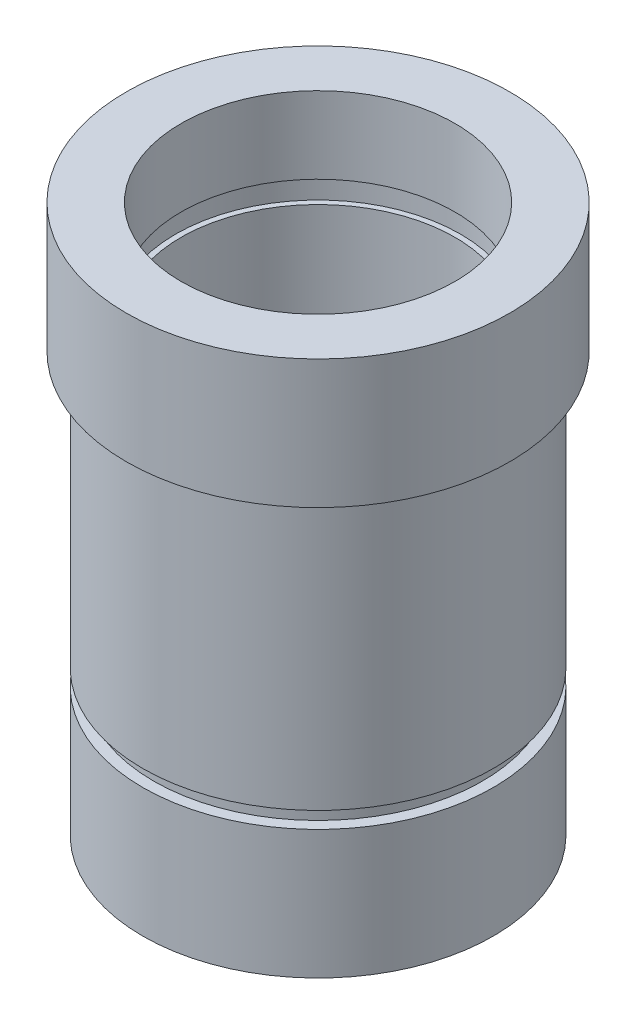
ISO-10303-21;
HEADER;
FILE_DESCRIPTION(('STEP AP214'),'2;1');
FILE_NAME('part.step','',(''),(''),'','','');
FILE_SCHEMA(('AUTOMOTIVE_DESIGN { 1 0 10303 214 1 1 1 1 }'));
ENDSEC;
DATA;
#1=APPLICATION_CONTEXT('core data for automotive mechanical design processes');
#2=APPLICATION_PROTOCOL_DEFINITION('international standard','automotive_design',2000,#1);
#3=PRODUCT_CONTEXT('',#1,'mechanical');
#4=PRODUCT('Part','Part','',(#3));
#5=PRODUCT_RELATED_PRODUCT_CATEGORY('part','',(#4));
#6=PRODUCT_DEFINITION_FORMATION('','',#4);
#7=PRODUCT_DEFINITION_CONTEXT('part definition',#1,'design');
#8=PRODUCT_DEFINITION('design','',#6,#7);
#9=PRODUCT_DEFINITION_SHAPE('','',#8);
#10=(LENGTH_UNIT() NAMED_UNIT(*) SI_UNIT(.MILLI.,.METRE.));
#11=(NAMED_UNIT(*) PLANE_ANGLE_UNIT() SI_UNIT($,.RADIAN.));
#12=(NAMED_UNIT(*) SI_UNIT($,.STERADIAN.) SOLID_ANGLE_UNIT());
#13=UNCERTAINTY_MEASURE_WITH_UNIT(LENGTH_MEASURE(1.E-05),#10,'distance_accuracy_value','');
#14=(GEOMETRIC_REPRESENTATION_CONTEXT(3) GLOBAL_UNCERTAINTY_ASSIGNED_CONTEXT((#13)) GLOBAL_UNIT_ASSIGNED_CONTEXT((#10,
#11,#12)) REPRESENTATION_CONTEXT('',''));
#15=CARTESIAN_POINT('',(0.,0.,0.));
#16=DIRECTION('',(0.,0.,1.));
#17=DIRECTION('',(1.,0.,0.));
#18=AXIS2_PLACEMENT_3D('',#15,#16,#17);
#19=CARTESIAN_POINT('',(0.,-26.8678822354766,0.));
#20=DIRECTION('',(0.,1.,0.));
#21=DIRECTION('',(0.,0.,1.));
#22=AXIS2_PLACEMENT_3D('',#19,#20,#21);
#23=CYLINDRICAL_SURFACE('',#22,12.5);
#24=CARTESIAN_POINT('',(0.,14.1321177645234,0.));
#25=DIRECTION('',(0.,1.,0.));
#26=DIRECTION('',(0.,0.,1.));
#27=AXIS2_PLACEMENT_3D('',#24,#25,#26);
#28=CIRCLE('',#27,12.5);
#29=CARTESIAN_POINT('',(0.,14.1321177645234,12.5));
#30=VERTEX_POINT('',#29);
#31=EDGE_CURVE('E55',#30,#30,#28,.F.);
#32=CARTESIAN_POINT('',(0.,-17.8678822354766,0.));
#33=DIRECTION('',(0.,-1.,0.));
#34=DIRECTION('',(0.,0.,-1.));
#35=AXIS2_PLACEMENT_3D('',#32,#33,#34);
#36=CIRCLE('',#35,12.5);
#37=CARTESIAN_POINT('',(0.,-17.8678822354766,12.5));
#38=VERTEX_POINT('',#37);
#39=EDGE_CURVE('E39',#38,#38,#36,.F.);
#40=CARTESIAN_POINT('',(0.,14.1321177645234,12.5));
#41=CARTESIAN_POINT('',(0.,13.7987844311901,12.5));
#42=CARTESIAN_POINT('',(0.,13.4654510978568,12.5));
#43=CARTESIAN_POINT('',(0.,12.7987844311901,12.5));
#44=CARTESIAN_POINT('',(0.,12.4654510978568,12.5));
#45=CARTESIAN_POINT('',(0.,11.7987844311901,12.5));
#46=CARTESIAN_POINT('',(0.,11.4654510978568,12.5));
#47=CARTESIAN_POINT('',(0.,10.7987844311901,12.5));
#48=CARTESIAN_POINT('',(0.,10.4654510978568,12.5));
#49=CARTESIAN_POINT('',(0.,9.7987844311901,12.5));
#50=CARTESIAN_POINT('',(0.,9.46545109785677,12.5));
#51=CARTESIAN_POINT('',(0.,8.7987844311901,12.5));
#52=CARTESIAN_POINT('',(0.,8.46545109785676,12.5));
#53=CARTESIAN_POINT('',(0.,7.7987844311901,12.5));
#54=CARTESIAN_POINT('',(0.,7.46545109785677,12.5));
#55=CARTESIAN_POINT('',(0.,6.7987844311901,12.5));
#56=CARTESIAN_POINT('',(0.,6.46545109785677,12.5));
#57=CARTESIAN_POINT('',(0.,5.7987844311901,12.5));
#58=CARTESIAN_POINT('',(0.,5.46545109785677,12.5));
#59=CARTESIAN_POINT('',(0.,4.7987844311901,12.5));
#60=CARTESIAN_POINT('',(0.,4.46545109785677,12.5));
#61=CARTESIAN_POINT('',(0.,3.79878443119011,12.5));
#62=CARTESIAN_POINT('',(0.,3.46545109785677,12.5));
#63=CARTESIAN_POINT('',(0.,2.7987844311901,12.5));
#64=CARTESIAN_POINT('',(0.,2.46545109785677,12.5));
#65=CARTESIAN_POINT('',(0.,1.7987844311901,12.5));
#66=CARTESIAN_POINT('',(0.,1.46545109785677,12.5));
#67=CARTESIAN_POINT('',(0.,0.798784431190106,12.5));
#68=CARTESIAN_POINT('',(0.,0.465451097856772,12.5));
#69=CARTESIAN_POINT('',(0.,-0.201215568809894,12.5));
#70=CARTESIAN_POINT('',(0.,-0.534548902143226,12.5));
#71=CARTESIAN_POINT('',(0.,-1.20121556880989,12.5));
#72=CARTESIAN_POINT('',(0.,-1.53454890214323,12.5));
#73=CARTESIAN_POINT('',(0.,-2.20121556880989,12.5));
#74=CARTESIAN_POINT('',(0.,-2.53454890214323,12.5));
#75=CARTESIAN_POINT('',(0.,-3.20121556880989,12.5));
#76=CARTESIAN_POINT('',(0.,-3.53454890214323,12.5));
#77=CARTESIAN_POINT('',(0.,-4.20121556880989,12.5));
#78=CARTESIAN_POINT('',(0.,-4.53454890214323,12.5));
#79=CARTESIAN_POINT('',(0.,-5.20121556880989,12.5));
#80=CARTESIAN_POINT('',(0.,-5.53454890214322,12.5));
#81=CARTESIAN_POINT('',(0.,-6.20121556880989,12.5));
#82=CARTESIAN_POINT('',(0.,-6.53454890214322,12.5));
#83=CARTESIAN_POINT('',(0.,-7.20121556880989,12.5));
#84=CARTESIAN_POINT('',(0.,-7.53454890214322,12.5));
#85=CARTESIAN_POINT('',(0.,-8.20121556880989,12.5));
#86=CARTESIAN_POINT('',(0.,-8.53454890214322,12.5));
#87=CARTESIAN_POINT('',(0.,-9.20121556880989,12.5));
#88=CARTESIAN_POINT('',(0.,-9.53454890214322,12.5));
#89=CARTESIAN_POINT('',(0.,-10.2012155688099,12.5));
#90=CARTESIAN_POINT('',(0.,-10.5345489021432,12.5));
#91=CARTESIAN_POINT('',(0.,-11.2012155688099,12.5));
#92=CARTESIAN_POINT('',(0.,-11.5345489021432,12.5));
#93=CARTESIAN_POINT('',(0.,-12.2012155688099,12.5));
#94=CARTESIAN_POINT('',(0.,-12.5345489021432,12.5));
#95=CARTESIAN_POINT('',(0.,-13.2012155688099,12.5));
#96=CARTESIAN_POINT('',(0.,-13.5345489021432,12.5));
#97=CARTESIAN_POINT('',(0.,-14.2012155688099,12.5));
#98=CARTESIAN_POINT('',(0.,-14.5345489021432,12.5));
#99=CARTESIAN_POINT('',(0.,-15.2012155688099,12.5));
#100=CARTESIAN_POINT('',(0.,-15.5345489021432,12.5));
#101=CARTESIAN_POINT('',(0.,-16.2012155688099,12.5));
#102=CARTESIAN_POINT('',(0.,-16.5345489021432,12.5));
#103=CARTESIAN_POINT('',(0.,-17.2012155688099,12.5));
#104=CARTESIAN_POINT('',(0.,-17.5345489021432,12.5));
#105=CARTESIAN_POINT('',(0.,-17.8678822354766,12.5));
#106=B_SPLINE_CURVE_WITH_KNOTS('',3,(#40,#41,#42,#43,#44,#45,#46,#47,#48,#49,#50,#51,#52,#53,
#54,#55,#56,#57,#58,#59,#60,#61,#62,#63,#64,#65,#66,#67,#68,#69,#70,#71,#72,#73,#74,#75,#76,#77,
#78,#79,#80,#81,#82,#83,#84,#85,#86,#87,#88,#89,#90,#91,#92,#93,#94,#95,#96,#97,#98,#99,#100,
#101,#102,#103,#104,#105),.UNSPECIFIED.,.F.,.F.,(4,2,2,2,2,2,2,2,2,2,2,2,2,2,2,2,2,2,2,2,2,2,2,
2,2,2,2,2,2,2,2,2,4),(0.,1.,2.,3.,4.,5.,6.,7.,7.99999999999999,8.99999999999999,
9.99999999999999,11.,12.,13.,14.,15.,16.,17.,18.,19.,20.,21.,22.,23.,24.,25.,26.,27.,28.,29.,
30.,31.,32.),.UNSPECIFIED.);
#107=EDGE_CURVE('BSEAM35',#30,#38,#106,.T.);
#108=ORIENTED_EDGE('',*,*,#31,.F.);
#109=ORIENTED_EDGE('',*,*,#39,.F.);
#110=ORIENTED_EDGE('',*,*,#107,.T.);
#111=ORIENTED_EDGE('',*,*,#107,.F.);
#112=EDGE_LOOP('',(#108,#110,#109,#111));
#113=FACE_BOUND('',#112,.T.);
#114=ADVANCED_FACE('F35',(#113),#23,.F.);
#115=CARTESIAN_POINT('',(0.,-19.8678822354766,0.));
#116=DIRECTION('',(0.,-1.,0.));
#117=DIRECTION('',(0.,0.,-1.));
#118=AXIS2_PLACEMENT_3D('',#115,#116,#117);
#119=CIRCLE('',#118,12.5);
#120=CARTESIAN_POINT('',(0.,-19.8678822354766,12.5));
#121=VERTEX_POINT('',#120);
#122=EDGE_CURVE('E59',#121,#121,#119,.F.);
#123=CARTESIAN_POINT('',(0.,-26.8678822354766,0.));
#124=DIRECTION('',(0.,1.,0.));
#125=DIRECTION('',(0.,0.,1.));
#126=AXIS2_PLACEMENT_3D('',#123,#124,#125);
#127=CIRCLE('',#126,12.5);
#128=CARTESIAN_POINT('',(0.,-26.8678822354766,12.5));
#129=VERTEX_POINT('',#128);
#130=EDGE_CURVE('E78',#129,#129,#127,.T.);
#131=CARTESIAN_POINT('',(0.,-19.8678822354766,12.5));
#132=CARTESIAN_POINT('',(0.,-19.9407989021432,12.5));
#133=CARTESIAN_POINT('',(0.,-20.0137155688099,12.5));
#134=CARTESIAN_POINT('',(0.,-20.1595489021432,12.5));
#135=CARTESIAN_POINT('',(0.,-20.2324655688099,12.5));
#136=CARTESIAN_POINT('',(0.,-20.3782989021432,12.5));
#137=CARTESIAN_POINT('',(0.,-20.4512155688099,12.5));
#138=CARTESIAN_POINT('',(0.,-20.5970489021432,12.5));
#139=CARTESIAN_POINT('',(0.,-20.6699655688099,12.5));
#140=CARTESIAN_POINT('',(0.,-20.8157989021432,12.5));
#141=CARTESIAN_POINT('',(0.,-20.8887155688099,12.5));
#142=CARTESIAN_POINT('',(0.,-21.0345489021432,12.5));
#143=CARTESIAN_POINT('',(0.,-21.1074655688099,12.5));
#144=CARTESIAN_POINT('',(0.,-21.2532989021432,12.5));
#145=CARTESIAN_POINT('',(0.,-21.3262155688099,12.5));
#146=CARTESIAN_POINT('',(0.,-21.4720489021432,12.5));
#147=CARTESIAN_POINT('',(0.,-21.5449655688099,12.5));
#148=CARTESIAN_POINT('',(0.,-21.6907989021432,12.5));
#149=CARTESIAN_POINT('',(0.,-21.7637155688099,12.5));
#150=CARTESIAN_POINT('',(0.,-21.9095489021432,12.5));
#151=CARTESIAN_POINT('',(0.,-21.9824655688099,12.5));
#152=CARTESIAN_POINT('',(0.,-22.1282989021432,12.5));
#153=CARTESIAN_POINT('',(0.,-22.2012155688099,12.5));
#154=CARTESIAN_POINT('',(0.,-22.3470489021432,12.5));
#155=CARTESIAN_POINT('',(0.,-22.4199655688099,12.5));
#156=CARTESIAN_POINT('',(0.,-22.5657989021432,12.5));
#157=CARTESIAN_POINT('',(0.,-22.6387155688099,12.5));
#158=CARTESIAN_POINT('',(0.,-22.7845489021432,12.5));
#159=CARTESIAN_POINT('',(0.,-22.8574655688099,12.5));
#160=CARTESIAN_POINT('',(0.,-23.0032989021432,12.5));
#161=CARTESIAN_POINT('',(0.,-23.0762155688099,12.5));
#162=CARTESIAN_POINT('',(0.,-23.2220489021432,12.5));
#163=CARTESIAN_POINT('',(0.,-23.2949655688099,12.5));
#164=CARTESIAN_POINT('',(0.,-23.4407989021432,12.5));
#165=CARTESIAN_POINT('',(0.,-23.5137155688099,12.5));
#166=CARTESIAN_POINT('',(0.,-23.6595489021432,12.5));
#167=CARTESIAN_POINT('',(0.,-23.7324655688099,12.5));
#168=CARTESIAN_POINT('',(0.,-23.8782989021432,12.5));
#169=CARTESIAN_POINT('',(0.,-23.9512155688099,12.5));
#170=CARTESIAN_POINT('',(0.,-24.0970489021432,12.5));
#171=CARTESIAN_POINT('',(0.,-24.1699655688099,12.5));
#172=CARTESIAN_POINT('',(0.,-24.3157989021432,12.5));
#173=CARTESIAN_POINT('',(0.,-24.3887155688099,12.5));
#174=CARTESIAN_POINT('',(0.,-24.5345489021432,12.5));
#175=CARTESIAN_POINT('',(0.,-24.6074655688099,12.5));
#176=CARTESIAN_POINT('',(0.,-24.7532989021432,12.5));
#177=CARTESIAN_POINT('',(0.,-24.8262155688099,12.5));
#178=CARTESIAN_POINT('',(0.,-24.9720489021432,12.5));
#179=CARTESIAN_POINT('',(0.,-25.0449655688099,12.5));
#180=CARTESIAN_POINT('',(0.,-25.1907989021432,12.5));
#181=CARTESIAN_POINT('',(0.,-25.2637155688099,12.5));
#182=CARTESIAN_POINT('',(0.,-25.4095489021432,12.5));
#183=CARTESIAN_POINT('',(0.,-25.4824655688099,12.5));
#184=CARTESIAN_POINT('',(0.,-25.6282989021432,12.5));
#185=CARTESIAN_POINT('',(0.,-25.7012155688099,12.5));
#186=CARTESIAN_POINT('',(0.,-25.8470489021432,12.5));
#187=CARTESIAN_POINT('',(0.,-25.9199655688099,12.5));
#188=CARTESIAN_POINT('',(0.,-26.0657989021432,12.5));
#189=CARTESIAN_POINT('',(0.,-26.1387155688099,12.5));
#190=CARTESIAN_POINT('',(0.,-26.2845489021432,12.5));
#191=CARTESIAN_POINT('',(0.,-26.3574655688099,12.5));
#192=CARTESIAN_POINT('',(0.,-26.5032989021432,12.5));
#193=CARTESIAN_POINT('',(0.,-26.5762155688099,12.5));
#194=CARTESIAN_POINT('',(0.,-26.7220489021432,12.5));
#195=CARTESIAN_POINT('',(0.,-26.7949655688099,12.5));
#196=CARTESIAN_POINT('',(0.,-26.8678822354766,12.5));
#197=B_SPLINE_CURVE_WITH_KNOTS('',3,(#131,#132,#133,#134,#135,#136,#137,#138,#139,#140,#141,
#142,#143,#144,#145,#146,#147,#148,#149,#150,#151,#152,#153,#154,#155,#156,#157,#158,#159,#160,
#161,#162,#163,#164,#165,#166,#167,#168,#169,#170,#171,#172,#173,#174,#175,#176,#177,#178,#179,
#180,#181,#182,#183,#184,#185,#186,#187,#188,#189,#190,#191,#192,#193,#194,#195,#196),
.UNSPECIFIED.,.F.,.F.,(4,2,2,2,2,2,2,2,2,2,2,2,2,2,2,2,2,2,2,2,2,2,2,2,2,2,2,2,2,2,2,2,4),(0.,
0.21875,0.4375,0.656250000000001,0.875000000000001,1.09375,1.3125,1.53125,1.75,1.96875,2.1875,
2.40625,2.625,2.84375,3.0625,3.28125,3.5,3.71875,3.9375,4.15625,4.375,4.59375,4.8125,5.03125,
5.25,5.46875,5.68750000000001,5.90625000000001,6.12500000000001,6.34375000000001,
6.56250000000001,6.78125000000001,7.),.UNSPECIFIED.);
#198=EDGE_CURVE('BSEAM143',#121,#129,#197,.T.);
#199=ORIENTED_EDGE('',*,*,#122,.T.);
#200=ORIENTED_EDGE('',*,*,#130,.F.);
#201=ORIENTED_EDGE('',*,*,#198,.T.);
#202=ORIENTED_EDGE('',*,*,#198,.F.);
#203=EDGE_LOOP('',(#199,#201,#200,#202));
#204=FACE_BOUND('',#203,.T.);
#205=ADVANCED_FACE('F143',(#204),#23,.F.);
#206=CARTESIAN_POINT('',(0.,23.1321177645234,0.));
#207=DIRECTION('',(0.,-1.,0.));
#208=DIRECTION('',(0.,0.,-1.));
#209=AXIS2_PLACEMENT_3D('',#206,#207,#208);
#210=PLANE('',#209);
#211=CARTESIAN_POINT('',(0.,23.1321177645234,0.));
#212=DIRECTION('',(0.,1.,0.));
#213=DIRECTION('',(0.,0.,1.));
#214=AXIS2_PLACEMENT_3D('',#211,#212,#213);
#215=CIRCLE('',#214,12.5);
#216=CARTESIAN_POINT('',(0.,23.1321177645234,12.5));
#217=VERTEX_POINT('',#216);
#218=EDGE_CURVE('E58',#217,#217,#215,.T.);
#219=ORIENTED_EDGE('',*,*,#218,.F.);
#220=EDGE_LOOP('',(#219));
#221=FACE_BOUND('',#220,.T.);
#222=CARTESIAN_POINT('',(0.,23.1321177645234,0.));
#223=DIRECTION('',(0.,1.,0.));
#224=DIRECTION('',(0.,0.,1.));
#225=AXIS2_PLACEMENT_3D('',#222,#223,#224);
#226=CIRCLE('',#225,17.5);
#227=CARTESIAN_POINT('',(0.,23.1321177645234,17.5));
#228=VERTEX_POINT('',#227);
#229=EDGE_CURVE('E10',#228,#228,#226,.T.);
#230=ORIENTED_EDGE('',*,*,#229,.T.);
#231=EDGE_LOOP('',(#230));
#232=FACE_BOUND('',#231,.T.);
#233=ADVANCED_FACE('F37',(#221,#232),#210,.F.);
#234=CARTESIAN_POINT('',(0.,23.3627204030227,0.));
#235=DIRECTION('',(0.,1.,0.));
#236=DIRECTION('',(0.,0.,1.));
#237=AXIS2_PLACEMENT_3D('',#234,#235,#236);
#238=CYLINDRICAL_SURFACE('',#237,17.5);
#239=ORIENTED_EDGE('',*,*,#229,.F.);
#240=EDGE_LOOP('',(#239));
#241=FACE_BOUND('',#240,.T.);
#242=CARTESIAN_POINT('',(0.,11.3821177645234,0.));
#243=DIRECTION('',(0.,1.,0.));
#244=DIRECTION('',(0.,0.,1.));
#245=AXIS2_PLACEMENT_3D('',#242,#243,#244);
#246=CIRCLE('',#245,17.5);
#247=CARTESIAN_POINT('',(0.,11.3821177645234,17.5));
#248=VERTEX_POINT('',#247);
#249=EDGE_CURVE('E43',#248,#248,#246,.T.);
#250=ORIENTED_EDGE('',*,*,#249,.T.);
#251=EDGE_LOOP('',(#250));
#252=FACE_BOUND('',#251,.T.);
#253=ADVANCED_FACE('F259',(#241,#252),#238,.T.);
#254=CARTESIAN_POINT('',(17.5,11.3821177645234,0.));
#255=DIRECTION('',(0.,1.,0.));
#256=DIRECTION('',(0.,0.,1.));
#257=AXIS2_PLACEMENT_3D('',#254,#255,#256);
#258=PLANE('',#257);
#259=ORIENTED_EDGE('',*,*,#249,.F.);
#260=EDGE_LOOP('',(#259));
#261=FACE_BOUND('',#260,.T.);
#262=CARTESIAN_POINT('',(0.,11.3821177645234,0.));
#263=DIRECTION('',(0.,1.,0.));
#264=DIRECTION('',(0.,0.,1.));
#265=AXIS2_PLACEMENT_3D('',#262,#263,#264);
#266=CIRCLE('',#265,16.);
#267=CARTESIAN_POINT('',(0.,11.3821177645234,16.));
#268=VERTEX_POINT('',#267);
#269=EDGE_CURVE('E48',#268,#268,#266,.T.);
#270=ORIENTED_EDGE('',*,*,#269,.T.);
#271=EDGE_LOOP('',(#270));
#272=FACE_BOUND('',#271,.T.);
#273=ADVANCED_FACE('F100',(#261,#272),#258,.F.);
#274=CARTESIAN_POINT('',(0.,23.3627204030227,0.));
#275=DIRECTION('',(0.,1.,0.));
#276=DIRECTION('',(0.,0.,1.));
#277=AXIS2_PLACEMENT_3D('',#274,#275,#276);
#278=CYLINDRICAL_SURFACE('',#277,16.);
#279=ORIENTED_EDGE('',*,*,#269,.F.);
#280=EDGE_LOOP('',(#279));
#281=FACE_BOUND('',#280,.T.);
#282=CARTESIAN_POINT('',(0.,-13.6178822354766,0.));
#283=DIRECTION('',(0.,1.,0.));
#284=DIRECTION('',(0.,0.,1.));
#285=AXIS2_PLACEMENT_3D('',#282,#283,#284);
#286=CIRCLE('',#285,16.);
#287=CARTESIAN_POINT('',(0.,-13.6178822354766,16.));
#288=VERTEX_POINT('',#287);
#289=EDGE_CURVE('E95',#288,#288,#286,.T.);
#290=ORIENTED_EDGE('',*,*,#289,.T.);
#291=EDGE_LOOP('',(#290));
#292=FACE_BOUND('',#291,.T.);
#293=ADVANCED_FACE('F102',(#281,#292),#278,.T.);
#294=CARTESIAN_POINT('',(16.,-13.6178822354766,0.));
#295=DIRECTION('',(0.,1.,0.));
#296=DIRECTION('',(0.,0.,1.));
#297=AXIS2_PLACEMENT_3D('',#294,#295,#296);
#298=PLANE('',#297);
#299=ORIENTED_EDGE('',*,*,#289,.F.);
#300=EDGE_LOOP('',(#299));
#301=FACE_BOUND('',#300,.T.);
#302=CARTESIAN_POINT('',(0.,-13.6178822354766,0.));
#303=DIRECTION('',(0.,1.,0.));
#304=DIRECTION('',(0.,0.,1.));
#305=AXIS2_PLACEMENT_3D('',#302,#303,#304);
#306=CIRCLE('',#305,15.);
#307=CARTESIAN_POINT('',(0.,-13.6178822354766,15.));
#308=VERTEX_POINT('',#307);
#309=EDGE_CURVE('E92',#308,#308,#306,.T.);
#310=ORIENTED_EDGE('',*,*,#309,.T.);
#311=EDGE_LOOP('',(#310));
#312=FACE_BOUND('',#311,.T.);
#313=ADVANCED_FACE('F105',(#301,#312),#298,.F.);
#314=CARTESIAN_POINT('',(0.,23.3627204030227,0.));
#315=DIRECTION('',(0.,1.,0.));
#316=DIRECTION('',(0.,0.,1.));
#317=AXIS2_PLACEMENT_3D('',#314,#315,#316);
#318=CYLINDRICAL_SURFACE('',#317,15.);
#319=ORIENTED_EDGE('',*,*,#309,.F.);
#320=EDGE_LOOP('',(#319));
#321=FACE_BOUND('',#320,.T.);
#322=CARTESIAN_POINT('',(0.,-15.1178822354766,0.));
#323=DIRECTION('',(0.,1.,0.));
#324=DIRECTION('',(0.,0.,1.));
#325=AXIS2_PLACEMENT_3D('',#322,#323,#324);
#326=CIRCLE('',#325,15.);
#327=CARTESIAN_POINT('',(0.,-15.1178822354766,15.));
#328=VERTEX_POINT('',#327);
#329=EDGE_CURVE('E89',#328,#328,#326,.T.);
#330=ORIENTED_EDGE('',*,*,#329,.T.);
#331=EDGE_LOOP('',(#330));
#332=FACE_BOUND('',#331,.T.);
#333=ADVANCED_FACE('F111',(#321,#332),#318,.T.);
#334=CARTESIAN_POINT('',(15.,-15.1178822354766,0.));
#335=DIRECTION('',(0.,-1.,0.));
#336=DIRECTION('',(0.,0.,-1.));
#337=AXIS2_PLACEMENT_3D('',#334,#335,#336);
#338=PLANE('',#337);
#339=ORIENTED_EDGE('',*,*,#329,.F.);
#340=EDGE_LOOP('',(#339));
#341=FACE_BOUND('',#340,.T.);
#342=CARTESIAN_POINT('',(0.,-15.1178822354766,0.));
#343=DIRECTION('',(0.,1.,0.));
#344=DIRECTION('',(0.,0.,1.));
#345=AXIS2_PLACEMENT_3D('',#342,#343,#344);
#346=CIRCLE('',#345,16.);
#347=CARTESIAN_POINT('',(0.,-15.1178822354766,16.));
#348=VERTEX_POINT('',#347);
#349=EDGE_CURVE('E86',#348,#348,#346,.T.);
#350=ORIENTED_EDGE('',*,*,#349,.T.);
#351=EDGE_LOOP('',(#350));
#352=FACE_BOUND('',#351,.T.);
#353=ADVANCED_FACE('F117',(#341,#352),#338,.F.);
#354=CARTESIAN_POINT('',(0.,23.3627204030227,0.));
#355=DIRECTION('',(0.,1.,0.));
#356=DIRECTION('',(0.,0.,1.));
#357=AXIS2_PLACEMENT_3D('',#354,#355,#356);
#358=CYLINDRICAL_SURFACE('',#357,16.);
#359=ORIENTED_EDGE('',*,*,#349,.F.);
#360=EDGE_LOOP('',(#359));
#361=FACE_BOUND('',#360,.T.);
#362=CARTESIAN_POINT('',(0.,-26.8678822354766,0.));
#363=DIRECTION('',(0.,1.,0.));
#364=DIRECTION('',(0.,0.,1.));
#365=AXIS2_PLACEMENT_3D('',#362,#363,#364);
#366=CIRCLE('',#365,16.);
#367=CARTESIAN_POINT('',(0.,-26.8678822354766,16.));
#368=VERTEX_POINT('',#367);
#369=EDGE_CURVE('E81',#368,#368,#366,.T.);
#370=ORIENTED_EDGE('',*,*,#369,.T.);
#371=EDGE_LOOP('',(#370));
#372=FACE_BOUND('',#371,.T.);
#373=ADVANCED_FACE('F123',(#361,#372),#358,.T.);
#374=CARTESIAN_POINT('',(16.,-26.8678822354766,0.));
#375=DIRECTION('',(0.,1.,0.));
#376=DIRECTION('',(0.,0.,1.));
#377=AXIS2_PLACEMENT_3D('',#374,#375,#376);
#378=PLANE('',#377);
#379=ORIENTED_EDGE('',*,*,#130,.T.);
#380=EDGE_LOOP('',(#379));
#381=FACE_BOUND('',#380,.T.);
#382=ORIENTED_EDGE('',*,*,#369,.F.);
#383=EDGE_LOOP('',(#382));
#384=FACE_BOUND('',#383,.T.);
#385=ADVANCED_FACE('F129',(#381,#384),#378,.F.);
#386=CARTESIAN_POINT('',(0.,16.1321177645234,0.));
#387=DIRECTION('',(0.,1.,0.));
#388=DIRECTION('',(0.,0.,1.));
#389=AXIS2_PLACEMENT_3D('',#386,#387,#388);
#390=CIRCLE('',#389,12.5);
#391=CARTESIAN_POINT('',(0.,16.1321177645234,12.5));
#392=VERTEX_POINT('',#391);
#393=EDGE_CURVE('E52',#392,#392,#390,.F.);
#394=CARTESIAN_POINT('',(0.,16.1321177645234,12.5));
#395=CARTESIAN_POINT('',(0.,16.2050344311901,12.5));
#396=CARTESIAN_POINT('',(0.,16.2779510978568,12.5));
#397=CARTESIAN_POINT('',(0.,16.4237844311901,12.5));
#398=CARTESIAN_POINT('',(0.,16.4967010978568,12.5));
#399=CARTESIAN_POINT('',(0.,16.6425344311901,12.5));
#400=CARTESIAN_POINT('',(0.,16.7154510978568,12.5));
#401=CARTESIAN_POINT('',(0.,16.8612844311901,12.5));
#402=CARTESIAN_POINT('',(0.,16.9342010978568,12.5));
#403=CARTESIAN_POINT('',(0.,17.0800344311901,12.5));
#404=CARTESIAN_POINT('',(0.,17.1529510978568,12.5));
#405=CARTESIAN_POINT('',(0.,17.2987844311901,12.5));
#406=CARTESIAN_POINT('',(0.,17.3717010978568,12.5));
#407=CARTESIAN_POINT('',(0.,17.5175344311901,12.5));
#408=CARTESIAN_POINT('',(0.,17.5904510978568,12.5));
#409=CARTESIAN_POINT('',(0.,17.7362844311901,12.5));
#410=CARTESIAN_POINT('',(0.,17.8092010978568,12.5));
#411=CARTESIAN_POINT('',(0.,17.9550344311901,12.5));
#412=CARTESIAN_POINT('',(0.,18.0279510978568,12.5));
#413=CARTESIAN_POINT('',(0.,18.1737844311901,12.5));
#414=CARTESIAN_POINT('',(0.,18.2467010978568,12.5));
#415=CARTESIAN_POINT('',(0.,18.3925344311901,12.5));
#416=CARTESIAN_POINT('',(0.,18.4654510978568,12.5));
#417=CARTESIAN_POINT('',(0.,18.6112844311901,12.5));
#418=CARTESIAN_POINT('',(0.,18.6842010978568,12.5));
#419=CARTESIAN_POINT('',(0.,18.8300344311901,12.5));
#420=CARTESIAN_POINT('',(0.,18.9029510978568,12.5));
#421=CARTESIAN_POINT('',(0.,19.0487844311901,12.5));
#422=CARTESIAN_POINT('',(0.,19.1217010978568,12.5));
#423=CARTESIAN_POINT('',(0.,19.2675344311901,12.5));
#424=CARTESIAN_POINT('',(0.,19.3404510978568,12.5));
#425=CARTESIAN_POINT('',(0.,19.4862844311901,12.5));
#426=CARTESIAN_POINT('',(0.,19.5592010978568,12.5));
#427=CARTESIAN_POINT('',(0.,19.7050344311901,12.5));
#428=CARTESIAN_POINT('',(0.,19.7779510978568,12.5));
#429=CARTESIAN_POINT('',(0.,19.9237844311901,12.5));
#430=CARTESIAN_POINT('',(0.,19.9967010978568,12.5));
#431=CARTESIAN_POINT('',(0.,20.1425344311901,12.5));
#432=CARTESIAN_POINT('',(0.,20.2154510978568,12.5));
#433=CARTESIAN_POINT('',(0.,20.3612844311901,12.5));
#434=CARTESIAN_POINT('',(0.,20.4342010978568,12.5));
#435=CARTESIAN_POINT('',(0.,20.5800344311901,12.5));
#436=CARTESIAN_POINT('',(0.,20.6529510978568,12.5));
#437=CARTESIAN_POINT('',(0.,20.7987844311901,12.5));
#438=CARTESIAN_POINT('',(0.,20.8717010978568,12.5));
#439=CARTESIAN_POINT('',(0.,21.0175344311901,12.5));
#440=CARTESIAN_POINT('',(0.,21.0904510978568,12.5));
#441=CARTESIAN_POINT('',(0.,21.2362844311901,12.5));
#442=CARTESIAN_POINT('',(0.,21.3092010978568,12.5));
#443=CARTESIAN_POINT('',(0.,21.4550344311901,12.5));
#444=CARTESIAN_POINT('',(0.,21.5279510978568,12.5));
#445=CARTESIAN_POINT('',(0.,21.6737844311901,12.5));
#446=CARTESIAN_POINT('',(0.,21.7467010978568,12.5));
#447=CARTESIAN_POINT('',(0.,21.8925344311901,12.5));
#448=CARTESIAN_POINT('',(0.,21.9654510978568,12.5));
#449=CARTESIAN_POINT('',(0.,22.1112844311901,12.5));
#450=CARTESIAN_POINT('',(0.,22.1842010978568,12.5));
#451=CARTESIAN_POINT('',(0.,22.3300344311901,12.5));
#452=CARTESIAN_POINT('',(0.,22.4029510978568,12.5));
#453=CARTESIAN_POINT('',(0.,22.5487844311901,12.5));
#454=CARTESIAN_POINT('',(0.,22.6217010978568,12.5));
#455=CARTESIAN_POINT('',(0.,22.7675344311901,12.5));
#456=CARTESIAN_POINT('',(0.,22.8404510978568,12.5));
#457=CARTESIAN_POINT('',(0.,22.9862844311901,12.5));
#458=CARTESIAN_POINT('',(0.,23.0592010978568,12.5));
#459=CARTESIAN_POINT('',(0.,23.1321177645234,12.5));
#460=B_SPLINE_CURVE_WITH_KNOTS('',3,(#394,#395,#396,#397,#398,#399,#400,#401,#402,#403,#404,
#405,#406,#407,#408,#409,#410,#411,#412,#413,#414,#415,#416,#417,#418,#419,#420,#421,#422,#423,
#424,#425,#426,#427,#428,#429,#430,#431,#432,#433,#434,#435,#436,#437,#438,#439,#440,#441,#442,
#443,#444,#445,#446,#447,#448,#449,#450,#451,#452,#453,#454,#455,#456,#457,#458,#459),
.UNSPECIFIED.,.F.,.F.,(4,2,2,2,2,2,2,2,2,2,2,2,2,2,2,2,2,2,2,2,2,2,2,2,2,2,2,2,2,2,2,2,4),(0.,
0.218750000000004,0.4375,0.656249999999997,0.875000000000001,1.09375,1.3125,1.53125,1.75,
1.96875000000001,2.1875,2.40625,2.625,2.84375000000001,3.0625,3.28125,3.5,3.71875000000001,
3.9375,4.15625,4.375,4.59375000000001,4.8125,5.03125,5.25,5.46875000000001,5.68750000000001,
5.90625,6.12500000000001,6.34375000000001,6.56250000000001,6.78125,7.00000000000001),.UNSPECIFIED.);
#461=EDGE_CURVE('BSEAM134',#392,#217,#460,.T.);
#462=ORIENTED_EDGE('',*,*,#393,.T.);
#463=ORIENTED_EDGE('',*,*,#218,.T.);
#464=ORIENTED_EDGE('',*,*,#461,.T.);
#465=ORIENTED_EDGE('',*,*,#461,.F.);
#466=EDGE_LOOP('',(#462,#464,#463,#465));
#467=FACE_BOUND('',#466,.T.);
#468=ADVANCED_FACE('F134',(#467),#23,.F.);
#469=CARTESIAN_POINT('',(0.,14.1321177645234,0.));
#470=DIRECTION('',(0.,1.,0.));
#471=DIRECTION('',(0.,0.,1.));
#472=AXIS2_PLACEMENT_3D('',#469,#470,#471);
#473=PLANE('',#472);
#474=CARTESIAN_POINT('',(0.,14.1321177645234,0.));
#475=DIRECTION('',(0.,1.,0.));
#476=DIRECTION('',(0.,0.,1.));
#477=AXIS2_PLACEMENT_3D('',#474,#475,#476);
#478=CIRCLE('',#477,13.);
#479=CARTESIAN_POINT('',(0.,14.1321177645234,13.));
#480=VERTEX_POINT('',#479);
#481=EDGE_CURVE('E56',#480,#480,#478,.T.);
#482=ORIENTED_EDGE('',*,*,#481,.T.);
#483=EDGE_LOOP('',(#482));
#484=FACE_BOUND('',#483,.T.);
#485=ORIENTED_EDGE('',*,*,#31,.T.);
#486=EDGE_LOOP('',(#485));
#487=FACE_BOUND('',#486,.T.);
#488=ADVANCED_FACE('F140',(#484,#487),#473,.T.);
#489=CARTESIAN_POINT('',(0.,16.1321177645234,0.));
#490=DIRECTION('',(0.,1.,0.));
#491=DIRECTION('',(0.,0.,1.));
#492=AXIS2_PLACEMENT_3D('',#489,#490,#491);
#493=PLANE('',#492);
#494=CARTESIAN_POINT('',(0.,16.1321177645234,0.));
#495=DIRECTION('',(0.,1.,0.));
#496=DIRECTION('',(0.,0.,1.));
#497=AXIS2_PLACEMENT_3D('',#494,#495,#496);
#498=CIRCLE('',#497,13.);
#499=CARTESIAN_POINT('',(0.,16.1321177645234,13.));
#500=VERTEX_POINT('',#499);
#501=EDGE_CURVE('E65',#500,#500,#498,.T.);
#502=ORIENTED_EDGE('',*,*,#501,.F.);
#503=EDGE_LOOP('',(#502));
#504=FACE_BOUND('',#503,.T.);
#505=ORIENTED_EDGE('',*,*,#393,.F.);
#506=EDGE_LOOP('',(#505));
#507=FACE_BOUND('',#506,.T.);
#508=ADVANCED_FACE('F156',(#504,#507),#493,.F.);
#509=CARTESIAN_POINT('',(0.,14.1321177645234,0.));
#510=DIRECTION('',(0.,1.,0.));
#511=DIRECTION('',(0.,0.,1.));
#512=AXIS2_PLACEMENT_3D('',#509,#510,#511);
#513=CYLINDRICAL_SURFACE('',#512,13.);
#514=ORIENTED_EDGE('',*,*,#481,.F.);
#515=EDGE_LOOP('',(#514));
#516=FACE_BOUND('',#515,.T.);
#517=ORIENTED_EDGE('',*,*,#501,.T.);
#518=EDGE_LOOP('',(#517));
#519=FACE_BOUND('',#518,.T.);
#520=ADVANCED_FACE('F152',(#516,#519),#513,.F.);
#521=CARTESIAN_POINT('',(0.,-17.8678822354766,0.));
#522=DIRECTION('',(0.,-1.,0.));
#523=DIRECTION('',(0.,0.,-1.));
#524=AXIS2_PLACEMENT_3D('',#521,#522,#523);
#525=PLANE('',#524);
#526=CARTESIAN_POINT('',(0.,-17.8678822354766,0.));
#527=DIRECTION('',(0.,-1.,0.));
#528=DIRECTION('',(0.,0.,-1.));
#529=AXIS2_PLACEMENT_3D('',#526,#527,#528);
#530=CIRCLE('',#529,13.);
#531=CARTESIAN_POINT('',(0.,-17.8678822354766,-13.));
#532=VERTEX_POINT('',#531);
#533=EDGE_CURVE('E61',#532,#532,#530,.T.);
#534=ORIENTED_EDGE('',*,*,#533,.T.);
#535=EDGE_LOOP('',(#534));
#536=FACE_BOUND('',#535,.T.);
#537=ORIENTED_EDGE('',*,*,#39,.T.);
#538=EDGE_LOOP('',(#537));
#539=FACE_BOUND('',#538,.T.);
#540=ADVANCED_FACE('F155',(#536,#539),#525,.T.);
#541=CARTESIAN_POINT('',(0.,-19.8678822354766,0.));
#542=DIRECTION('',(0.,-1.,0.));
#543=DIRECTION('',(0.,0.,-1.));
#544=AXIS2_PLACEMENT_3D('',#541,#542,#543);
#545=PLANE('',#544);
#546=CARTESIAN_POINT('',(0.,-19.8678822354766,0.));
#547=DIRECTION('',(0.,-1.,0.));
#548=DIRECTION('',(0.,0.,-1.));
#549=AXIS2_PLACEMENT_3D('',#546,#547,#548);
#550=CIRCLE('',#549,13.);
#551=CARTESIAN_POINT('',(0.,-19.8678822354766,-13.));
#552=VERTEX_POINT('',#551);
#553=EDGE_CURVE('E67',#552,#552,#550,.T.);
#554=ORIENTED_EDGE('',*,*,#553,.F.);
#555=EDGE_LOOP('',(#554));
#556=FACE_BOUND('',#555,.T.);
#557=ORIENTED_EDGE('',*,*,#122,.F.);
#558=EDGE_LOOP('',(#557));
#559=FACE_BOUND('',#558,.T.);
#560=ADVANCED_FACE('F167',(#556,#559),#545,.F.);
#561=CARTESIAN_POINT('',(0.,-17.8678822354766,0.));
#562=DIRECTION('',(0.,-1.,0.));
#563=DIRECTION('',(0.,0.,-1.));
#564=AXIS2_PLACEMENT_3D('',#561,#562,#563);
#565=CYLINDRICAL_SURFACE('',#564,13.);
#566=ORIENTED_EDGE('',*,*,#533,.F.);
#567=EDGE_LOOP('',(#566));
#568=FACE_BOUND('',#567,.T.);
#569=ORIENTED_EDGE('',*,*,#553,.T.);
#570=EDGE_LOOP('',(#569));
#571=FACE_BOUND('',#570,.T.);
#572=ADVANCED_FACE('F164',(#568,#571),#565,.F.);
#573=CLOSED_SHELL('',(#114,#205,#233,#253,#273,#293,#313,#333,#353,#373,#385,#468,#488,#508,
#520,#540,#560,#572));
#574=MANIFOLD_SOLID_BREP('B2',#573);
#575=ADVANCED_BREP_SHAPE_REPRESENTATION('',(#18,#574),#14);
#576=SHAPE_DEFINITION_REPRESENTATION(#9,#575);
ENDSEC;
END-ISO-10303-21;
